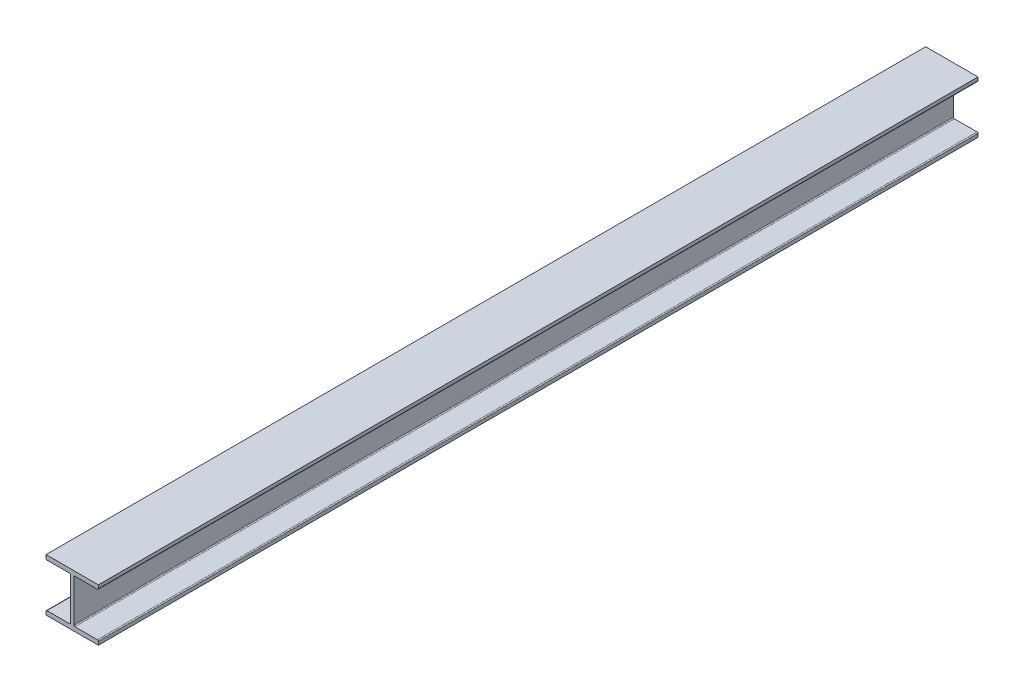
ISO-10303-21;
HEADER;
FILE_DESCRIPTION(('STEP AP214'),'2;1');
FILE_NAME('part.step','',(''),(''),'','','');
FILE_SCHEMA(('AUTOMOTIVE_DESIGN { 1 0 10303 214 1 1 1 1 }'));
ENDSEC;
DATA;
#1=APPLICATION_CONTEXT('core data for automotive mechanical design processes');
#2=APPLICATION_PROTOCOL_DEFINITION('international standard','automotive_design',2000,#1);
#3=PRODUCT_CONTEXT('',#1,'mechanical');
#4=PRODUCT('Part','Part','',(#3));
#5=PRODUCT_RELATED_PRODUCT_CATEGORY('part','',(#4));
#6=PRODUCT_DEFINITION_FORMATION('','',#4);
#7=PRODUCT_DEFINITION_CONTEXT('part definition',#1,'design');
#8=PRODUCT_DEFINITION('design','',#6,#7);
#9=PRODUCT_DEFINITION_SHAPE('','',#8);
#10=(LENGTH_UNIT() NAMED_UNIT(*) SI_UNIT(.MILLI.,.METRE.));
#11=(NAMED_UNIT(*) PLANE_ANGLE_UNIT() SI_UNIT($,.RADIAN.));
#12=(NAMED_UNIT(*) SI_UNIT($,.STERADIAN.) SOLID_ANGLE_UNIT());
#13=UNCERTAINTY_MEASURE_WITH_UNIT(LENGTH_MEASURE(1.E-05),#10,'distance_accuracy_value','');
#14=(GEOMETRIC_REPRESENTATION_CONTEXT(3) GLOBAL_UNCERTAINTY_ASSIGNED_CONTEXT((#13)) GLOBAL_UNIT_ASSIGNED_CONTEXT((#10,
#11,#12)) REPRESENTATION_CONTEXT('',''));
#15=CARTESIAN_POINT('',(0.,0.,0.));
#16=DIRECTION('',(0.,0.,1.));
#17=DIRECTION('',(1.,0.,0.));
#18=AXIS2_PLACEMENT_3D('',#15,#16,#17);
#19=CARTESIAN_POINT('',(0.,0.,2133.6));
#20=DIRECTION('',(0.,0.,-1.));
#21=DIRECTION('',(-1.,0.,0.));
#22=AXIS2_PLACEMENT_3D('',#19,#20,#21);
#23=PLANE('',#22);
#24=DIRECTION('',(0.,1.,0.));
#25=VECTOR('',#24,1.);
#26=CARTESIAN_POINT('',(63.5,-53.0352,2133.6));
#27=LINE('',#26,#25);
#28=CARTESIAN_POINT('',(63.5,-63.5,2133.6));
#29=VERTEX_POINT('',#28);
#30=CARTESIAN_POINT('',(63.5,-55.5752,2133.6));
#31=VERTEX_POINT('',#30);
#32=EDGE_CURVE('E202',#29,#31,#27,.T.);
#33=ORIENTED_EDGE('',*,*,#32,.T.);
#34=CARTESIAN_POINT('',(60.96,-55.5752,2133.6));
#35=DIRECTION('',(0.,0.,-1.));
#36=DIRECTION('',(-1.,0.,0.));
#37=AXIS2_PLACEMENT_3D('',#34,#35,#36);
#38=CIRCLE('',#37,2.54);
#39=CARTESIAN_POINT('',(60.96,-53.0352,2133.6));
#40=VERTEX_POINT('',#39);
#41=EDGE_CURVE('E244',#31,#40,#38,.F.);
#42=ORIENTED_EDGE('',*,*,#41,.T.);
#43=DIRECTION('',(-1.,0.,0.));
#44=VECTOR('',#43,1.);
#45=CARTESIAN_POINT('',(3.97510000000001,-53.0352,2133.6));
#46=LINE('',#45,#44);
#47=CARTESIAN_POINT('',(6.51510000000001,-53.0352,2133.6));
#48=VERTEX_POINT('',#47);
#49=EDGE_CURVE('E421',#40,#48,#46,.T.);
#50=ORIENTED_EDGE('',*,*,#49,.T.);
#51=CARTESIAN_POINT('',(6.51510000000001,-50.4952,2133.6));
#52=DIRECTION('',(0.,0.,-1.));
#53=DIRECTION('',(-1.,0.,0.));
#54=AXIS2_PLACEMENT_3D('',#51,#52,#53);
#55=CIRCLE('',#54,2.54);
#56=CARTESIAN_POINT('',(3.97510000000001,-50.4952,2133.6));
#57=VERTEX_POINT('',#56);
#58=EDGE_CURVE('E306',#48,#57,#55,.T.);
#59=ORIENTED_EDGE('',*,*,#58,.T.);
#60=DIRECTION('',(0.,1.,0.));
#61=VECTOR('',#60,1.);
#62=CARTESIAN_POINT('',(3.9751,33.9852,2133.6));
#63=LINE('',#62,#61);
#64=CARTESIAN_POINT('',(3.9751,50.4952,2133.6));
#65=VERTEX_POINT('',#64);
#66=EDGE_CURVE('E417',#57,#65,#63,.T.);
#67=ORIENTED_EDGE('',*,*,#66,.T.);
#68=CARTESIAN_POINT('',(6.5151,50.4952,2133.6));
#69=DIRECTION('',(0.,0.,-1.));
#70=DIRECTION('',(-1.,0.,0.));
#71=AXIS2_PLACEMENT_3D('',#68,#69,#70);
#72=CIRCLE('',#71,2.54);
#73=CARTESIAN_POINT('',(6.5151,53.0352,2133.6));
#74=VERTEX_POINT('',#73);
#75=EDGE_CURVE('E294',#65,#74,#72,.T.);
#76=ORIENTED_EDGE('',*,*,#75,.T.);
#77=DIRECTION('',(1.,0.,0.));
#78=VECTOR('',#77,1.);
#79=CARTESIAN_POINT('',(63.5,53.0352,2133.6));
#80=LINE('',#79,#78);
#81=CARTESIAN_POINT('',(60.96,53.0352,2133.6));
#82=VERTEX_POINT('',#81);
#83=EDGE_CURVE('E414',#74,#82,#80,.T.);
#84=ORIENTED_EDGE('',*,*,#83,.T.);
#85=CARTESIAN_POINT('',(60.96,55.5752,2133.6));
#86=DIRECTION('',(0.,0.,-1.));
#87=DIRECTION('',(-1.,0.,0.));
#88=AXIS2_PLACEMENT_3D('',#85,#86,#87);
#89=CIRCLE('',#88,2.54);
#90=CARTESIAN_POINT('',(63.5,55.5752,2133.6));
#91=VERTEX_POINT('',#90);
#92=EDGE_CURVE('E65',#82,#91,#89,.F.);
#93=ORIENTED_EDGE('',*,*,#92,.T.);
#94=DIRECTION('',(0.,1.,0.));
#95=VECTOR('',#94,1.);
#96=CARTESIAN_POINT('',(63.5,63.5,2133.6));
#97=LINE('',#96,#95);
#98=CARTESIAN_POINT('',(63.5,63.5,2133.6));
#99=VERTEX_POINT('',#98);
#100=EDGE_CURVE('E411',#91,#99,#97,.T.);
#101=ORIENTED_EDGE('',*,*,#100,.T.);
#102=DIRECTION('',(-1.,0.,0.));
#103=VECTOR('',#102,1.);
#104=CARTESIAN_POINT('',(-63.5,63.5,2133.6));
#105=LINE('',#104,#103);
#106=CARTESIAN_POINT('',(-63.5,63.5,2133.6));
#107=VERTEX_POINT('',#106);
#108=EDGE_CURVE('E388',#99,#107,#105,.T.);
#109=ORIENTED_EDGE('',*,*,#108,.T.);
#110=DIRECTION('',(0.,-1.,0.));
#111=VECTOR('',#110,1.);
#112=CARTESIAN_POINT('',(-63.5,63.5,2133.6));
#113=LINE('',#112,#111);
#114=CARTESIAN_POINT('',(-63.5,55.5752,2133.6));
#115=VERTEX_POINT('',#114);
#116=EDGE_CURVE('E401',#107,#115,#113,.T.);
#117=ORIENTED_EDGE('',*,*,#116,.T.);
#118=CARTESIAN_POINT('',(-60.96,55.5752,2133.6));
#119=DIRECTION('',(0.,0.,-1.));
#120=DIRECTION('',(-1.,0.,0.));
#121=AXIS2_PLACEMENT_3D('',#118,#119,#120);
#122=CIRCLE('',#121,2.54);
#123=CARTESIAN_POINT('',(-60.96,53.0352,2133.6));
#124=VERTEX_POINT('',#123);
#125=EDGE_CURVE('E239',#115,#124,#122,.F.);
#126=ORIENTED_EDGE('',*,*,#125,.T.);
#127=DIRECTION('',(1.,0.,0.));
#128=VECTOR('',#127,1.);
#129=CARTESIAN_POINT('',(-63.5,53.0352,2133.6));
#130=LINE('',#129,#128);
#131=CARTESIAN_POINT('',(-6.5151,53.0352,2133.6));
#132=VERTEX_POINT('',#131);
#133=EDGE_CURVE('E342',#124,#132,#130,.T.);
#134=ORIENTED_EDGE('',*,*,#133,.T.);
#135=CARTESIAN_POINT('',(-6.5151,50.4952,2133.6));
#136=DIRECTION('',(0.,0.,-1.));
#137=DIRECTION('',(-1.,0.,0.));
#138=AXIS2_PLACEMENT_3D('',#135,#136,#137);
#139=CIRCLE('',#138,2.54);
#140=CARTESIAN_POINT('',(-3.9751,50.4952,2133.6));
#141=VERTEX_POINT('',#140);
#142=EDGE_CURVE('E300',#132,#141,#139,.T.);
#143=ORIENTED_EDGE('',*,*,#142,.T.);
#144=DIRECTION('',(0.,-1.,0.));
#145=VECTOR('',#144,1.);
#146=CARTESIAN_POINT('',(-3.9751,33.9852,2133.6));
#147=LINE('',#146,#145);
#148=CARTESIAN_POINT('',(-3.97509999999998,-50.4952,2133.6));
#149=VERTEX_POINT('',#148);
#150=EDGE_CURVE('E331',#141,#149,#147,.T.);
#151=ORIENTED_EDGE('',*,*,#150,.T.);
#152=CARTESIAN_POINT('',(-6.51509999999998,-50.4952,2133.6));
#153=DIRECTION('',(0.,0.,-1.));
#154=DIRECTION('',(-1.,0.,0.));
#155=AXIS2_PLACEMENT_3D('',#152,#153,#154);
#156=CIRCLE('',#155,2.54);
#157=CARTESIAN_POINT('',(-6.51509999999998,-53.0352,2133.6));
#158=VERTEX_POINT('',#157);
#159=EDGE_CURVE('E11',#149,#158,#156,.T.);
#160=ORIENTED_EDGE('',*,*,#159,.T.);
#161=DIRECTION('',(-1.,0.,0.));
#162=VECTOR('',#161,1.);
#163=CARTESIAN_POINT('',(-3.97509999999998,-53.0352,2133.6));
#164=LINE('',#163,#162);
#165=CARTESIAN_POINT('',(-60.96,-53.0352,2133.6));
#166=VERTEX_POINT('',#165);
#167=EDGE_CURVE('E330',#158,#166,#164,.T.);
#168=ORIENTED_EDGE('',*,*,#167,.T.);
#169=CARTESIAN_POINT('',(-60.96,-55.5752,2133.6));
#170=DIRECTION('',(0.,0.,-1.));
#171=DIRECTION('',(-1.,0.,0.));
#172=AXIS2_PLACEMENT_3D('',#169,#170,#171);
#173=CIRCLE('',#172,2.54);
#174=CARTESIAN_POINT('',(-63.5,-55.5752,2133.6));
#175=VERTEX_POINT('',#174);
#176=EDGE_CURVE('E186',#166,#175,#173,.F.);
#177=ORIENTED_EDGE('',*,*,#176,.T.);
#178=DIRECTION('',(0.,-1.,0.));
#179=VECTOR('',#178,1.);
#180=CARTESIAN_POINT('',(-63.5,-53.0352,2133.6));
#181=LINE('',#180,#179);
#182=CARTESIAN_POINT('',(-63.5,-63.5,2133.6));
#183=VERTEX_POINT('',#182);
#184=EDGE_CURVE('E179',#175,#183,#181,.T.);
#185=ORIENTED_EDGE('',*,*,#184,.T.);
#186=DIRECTION('',(1.,0.,0.));
#187=VECTOR('',#186,1.);
#188=CARTESIAN_POINT('',(63.5,-63.5,2133.6));
#189=LINE('',#188,#187);
#190=EDGE_CURVE('E182',#183,#29,#189,.T.);
#191=ORIENTED_EDGE('',*,*,#190,.T.);
#192=EDGE_LOOP('',(#33,#42,#50,#59,#67,#76,#84,#93,#101,#109,#117,#126,#134,#143,#151,#160,#168,
#177,#185,#191));
#193=FACE_BOUND('',#192,.T.);
#194=ADVANCED_FACE('F41',(#193),#23,.F.);
#195=CARTESIAN_POINT('',(0.,0.,0.));
#196=DIRECTION('',(0.,0.,-1.));
#197=DIRECTION('',(-1.,0.,0.));
#198=AXIS2_PLACEMENT_3D('',#195,#196,#197);
#199=PLANE('',#198);
#200=DIRECTION('',(-1.,0.,0.));
#201=VECTOR('',#200,1.);
#202=CARTESIAN_POINT('',(3.97510000000001,-53.0352,0.));
#203=LINE('',#202,#201);
#204=CARTESIAN_POINT('',(60.96,-53.0352,0.));
#205=VERTEX_POINT('',#204);
#206=CARTESIAN_POINT('',(6.51510000000001,-53.0352,0.));
#207=VERTEX_POINT('',#206);
#208=EDGE_CURVE('E355',#205,#207,#203,.T.);
#209=ORIENTED_EDGE('',*,*,#208,.F.);
#210=CARTESIAN_POINT('',(60.96,-55.5752,0.));
#211=DIRECTION('',(0.,0.,-1.));
#212=DIRECTION('',(-1.,0.,0.));
#213=AXIS2_PLACEMENT_3D('',#210,#211,#212);
#214=CIRCLE('',#213,2.54);
#215=CARTESIAN_POINT('',(63.5,-55.5752,0.));
#216=VERTEX_POINT('',#215);
#217=EDGE_CURVE('E231',#205,#216,#214,.T.);
#218=ORIENTED_EDGE('',*,*,#217,.T.);
#219=DIRECTION('',(0.,1.,0.));
#220=VECTOR('',#219,1.);
#221=CARTESIAN_POINT('',(63.5,-53.0352,0.));
#222=LINE('',#221,#220);
#223=CARTESIAN_POINT('',(63.5,-63.5,0.));
#224=VERTEX_POINT('',#223);
#225=EDGE_CURVE('E351',#224,#216,#222,.T.);
#226=ORIENTED_EDGE('',*,*,#225,.F.);
#227=DIRECTION('',(1.,0.,0.));
#228=VECTOR('',#227,1.);
#229=CARTESIAN_POINT('',(63.5,-63.5,0.));
#230=LINE('',#229,#228);
#231=CARTESIAN_POINT('',(-63.5,-63.5,0.));
#232=VERTEX_POINT('',#231);
#233=EDGE_CURVE('E348',#232,#224,#230,.T.);
#234=ORIENTED_EDGE('',*,*,#233,.F.);
#235=DIRECTION('',(0.,-1.,0.));
#236=VECTOR('',#235,1.);
#237=CARTESIAN_POINT('',(-63.5,-53.0352,0.));
#238=LINE('',#237,#236);
#239=CARTESIAN_POINT('',(-63.5,-55.5752,0.));
#240=VERTEX_POINT('',#239);
#241=EDGE_CURVE('E206',#240,#232,#238,.T.);
#242=ORIENTED_EDGE('',*,*,#241,.F.);
#243=CARTESIAN_POINT('',(-60.96,-55.5752,0.));
#244=DIRECTION('',(0.,0.,-1.));
#245=DIRECTION('',(-1.,0.,0.));
#246=AXIS2_PLACEMENT_3D('',#243,#244,#245);
#247=CIRCLE('',#246,2.54);
#248=CARTESIAN_POINT('',(-60.96,-53.0352,0.));
#249=VERTEX_POINT('',#248);
#250=EDGE_CURVE('E228',#240,#249,#247,.T.);
#251=ORIENTED_EDGE('',*,*,#250,.T.);
#252=DIRECTION('',(-1.,0.,0.));
#253=VECTOR('',#252,1.);
#254=CARTESIAN_POINT('',(-3.97509999999998,-53.0352,0.));
#255=LINE('',#254,#253);
#256=CARTESIAN_POINT('',(-6.51509999999998,-53.0352,0.));
#257=VERTEX_POINT('',#256);
#258=EDGE_CURVE('E192',#257,#249,#255,.T.);
#259=ORIENTED_EDGE('',*,*,#258,.F.);
#260=CARTESIAN_POINT('',(-6.51509999999998,-50.4952,0.));
#261=DIRECTION('',(0.,0.,-1.));
#262=DIRECTION('',(-1.,0.,0.));
#263=AXIS2_PLACEMENT_3D('',#260,#261,#262);
#264=CIRCLE('',#263,2.54);
#265=CARTESIAN_POINT('',(-3.97509999999998,-50.4952,0.));
#266=VERTEX_POINT('',#265);
#267=EDGE_CURVE('E50',#257,#266,#264,.F.);
#268=ORIENTED_EDGE('',*,*,#267,.T.);
#269=DIRECTION('',(0.,-1.,0.));
#270=VECTOR('',#269,1.);
#271=CARTESIAN_POINT('',(-3.9751,33.9852,0.));
#272=LINE('',#271,#270);
#273=CARTESIAN_POINT('',(-3.9751,50.4952,0.));
#274=VERTEX_POINT('',#273);
#275=EDGE_CURVE('E315',#274,#266,#272,.T.);
#276=ORIENTED_EDGE('',*,*,#275,.F.);
#277=CARTESIAN_POINT('',(-6.5151,50.4952,0.));
#278=DIRECTION('',(0.,0.,-1.));
#279=DIRECTION('',(-1.,0.,0.));
#280=AXIS2_PLACEMENT_3D('',#277,#278,#279);
#281=CIRCLE('',#280,2.54);
#282=CARTESIAN_POINT('',(-6.5151,53.0352,0.));
#283=VERTEX_POINT('',#282);
#284=EDGE_CURVE('E297',#274,#283,#281,.F.);
#285=ORIENTED_EDGE('',*,*,#284,.T.);
#286=DIRECTION('',(1.,0.,0.));
#287=VECTOR('',#286,1.);
#288=CARTESIAN_POINT('',(-63.5,53.0352,0.));
#289=LINE('',#288,#287);
#290=CARTESIAN_POINT('',(-60.96,53.0352,0.));
#291=VERTEX_POINT('',#290);
#292=EDGE_CURVE('E326',#291,#283,#289,.T.);
#293=ORIENTED_EDGE('',*,*,#292,.F.);
#294=CARTESIAN_POINT('',(-60.96,55.5752,0.));
#295=DIRECTION('',(0.,0.,-1.));
#296=DIRECTION('',(-1.,0.,0.));
#297=AXIS2_PLACEMENT_3D('',#294,#295,#296);
#298=CIRCLE('',#297,2.54);
#299=CARTESIAN_POINT('',(-63.5,55.5752,0.));
#300=VERTEX_POINT('',#299);
#301=EDGE_CURVE('E225',#291,#300,#298,.T.);
#302=ORIENTED_EDGE('',*,*,#301,.T.);
#303=DIRECTION('',(0.,-1.,0.));
#304=VECTOR('',#303,1.);
#305=CARTESIAN_POINT('',(-63.5,63.5,0.));
#306=LINE('',#305,#304);
#307=CARTESIAN_POINT('',(-63.5,63.5,0.));
#308=VERTEX_POINT('',#307);
#309=EDGE_CURVE('E373',#308,#300,#306,.T.);
#310=ORIENTED_EDGE('',*,*,#309,.F.);
#311=DIRECTION('',(-1.,0.,0.));
#312=VECTOR('',#311,1.);
#313=CARTESIAN_POINT('',(-63.5,63.5,0.));
#314=LINE('',#313,#312);
#315=CARTESIAN_POINT('',(63.5,63.5,0.));
#316=VERTEX_POINT('',#315);
#317=EDGE_CURVE('E370',#316,#308,#314,.T.);
#318=ORIENTED_EDGE('',*,*,#317,.F.);
#319=DIRECTION('',(0.,1.,0.));
#320=VECTOR('',#319,1.);
#321=CARTESIAN_POINT('',(63.5,63.5,0.));
#322=LINE('',#321,#320);
#323=CARTESIAN_POINT('',(63.5,55.5752,0.));
#324=VERTEX_POINT('',#323);
#325=EDGE_CURVE('E367',#324,#316,#322,.T.);
#326=ORIENTED_EDGE('',*,*,#325,.F.);
#327=CARTESIAN_POINT('',(60.96,55.5752,0.));
#328=DIRECTION('',(0.,0.,-1.));
#329=DIRECTION('',(-1.,0.,0.));
#330=AXIS2_PLACEMENT_3D('',#327,#328,#329);
#331=CIRCLE('',#330,2.54);
#332=CARTESIAN_POINT('',(60.96,53.0352,0.));
#333=VERTEX_POINT('',#332);
#334=EDGE_CURVE('E222',#324,#333,#331,.T.);
#335=ORIENTED_EDGE('',*,*,#334,.T.);
#336=DIRECTION('',(1.,0.,0.));
#337=VECTOR('',#336,1.);
#338=CARTESIAN_POINT('',(63.5,53.0352,0.));
#339=LINE('',#338,#337);
#340=CARTESIAN_POINT('',(6.5151,53.0352,0.));
#341=VERTEX_POINT('',#340);
#342=EDGE_CURVE('E363',#341,#333,#339,.T.);
#343=ORIENTED_EDGE('',*,*,#342,.F.);
#344=CARTESIAN_POINT('',(6.5151,50.4952,0.));
#345=DIRECTION('',(0.,0.,-1.));
#346=DIRECTION('',(-1.,0.,0.));
#347=AXIS2_PLACEMENT_3D('',#344,#345,#346);
#348=CIRCLE('',#347,2.54);
#349=CARTESIAN_POINT('',(3.9751,50.4952,0.));
#350=VERTEX_POINT('',#349);
#351=EDGE_CURVE('E291',#341,#350,#348,.F.);
#352=ORIENTED_EDGE('',*,*,#351,.T.);
#353=DIRECTION('',(0.,1.,0.));
#354=VECTOR('',#353,1.);
#355=CARTESIAN_POINT('',(3.9751,33.9852,0.));
#356=LINE('',#355,#354);
#357=CARTESIAN_POINT('',(3.97510000000001,-50.4952,0.));
#358=VERTEX_POINT('',#357);
#359=EDGE_CURVE('E359',#358,#350,#356,.T.);
#360=ORIENTED_EDGE('',*,*,#359,.F.);
#361=CARTESIAN_POINT('',(6.51510000000001,-50.4952,0.));
#362=DIRECTION('',(0.,0.,-1.));
#363=DIRECTION('',(-1.,0.,0.));
#364=AXIS2_PLACEMENT_3D('',#361,#362,#363);
#365=CIRCLE('',#364,2.54);
#366=EDGE_CURVE('E303',#358,#207,#365,.F.);
#367=ORIENTED_EDGE('',*,*,#366,.T.);
#368=EDGE_LOOP('',(#209,#218,#226,#234,#242,#251,#259,#268,#276,#285,#293,#302,#310,#318,#326,
#335,#343,#352,#360,#367));
#369=FACE_BOUND('',#368,.T.);
#370=ADVANCED_FACE('F314',(#369),#199,.T.);
#371=CARTESIAN_POINT('',(-63.5,-53.0352,2133.6));
#372=DIRECTION('',(1.,0.,0.));
#373=DIRECTION('',(0.,0.,-1.));
#374=AXIS2_PLACEMENT_3D('',#371,#372,#373);
#375=PLANE('',#374);
#376=ORIENTED_EDGE('',*,*,#184,.F.);
#377=DIRECTION('',(0.,0.,-1.));
#378=VECTOR('',#377,1.);
#379=CARTESIAN_POINT('',(-63.5,-55.5752,2133.6));
#380=LINE('',#379,#378);
#381=EDGE_CURVE('E247',#175,#240,#380,.T.);
#382=ORIENTED_EDGE('',*,*,#381,.T.);
#383=ORIENTED_EDGE('',*,*,#241,.T.);
#384=DIRECTION('',(0.,0.,-1.));
#385=VECTOR('',#384,1.);
#386=CARTESIAN_POINT('',(-63.5,-63.5,2133.6));
#387=LINE('',#386,#385);
#388=EDGE_CURVE('E197',#183,#232,#387,.T.);
#389=ORIENTED_EDGE('',*,*,#388,.F.);
#390=EDGE_LOOP('',(#376,#382,#383,#389));
#391=FACE_BOUND('',#390,.T.);
#392=ADVANCED_FACE('F204',(#391),#375,.F.);
#393=CARTESIAN_POINT('',(63.5,-63.5,2133.6));
#394=DIRECTION('',(0.,1.,0.));
#395=DIRECTION('',(-1.,0.,0.));
#396=AXIS2_PLACEMENT_3D('',#393,#394,#395);
#397=PLANE('',#396);
#398=ORIENTED_EDGE('',*,*,#233,.T.);
#399=DIRECTION('',(0.,0.,-1.));
#400=VECTOR('',#399,1.);
#401=CARTESIAN_POINT('',(63.5,-63.5,2133.6));
#402=LINE('',#401,#400);
#403=EDGE_CURVE('E199',#29,#224,#402,.T.);
#404=ORIENTED_EDGE('',*,*,#403,.F.);
#405=ORIENTED_EDGE('',*,*,#190,.F.);
#406=ORIENTED_EDGE('',*,*,#388,.T.);
#407=EDGE_LOOP('',(#398,#404,#405,#406));
#408=FACE_BOUND('',#407,.T.);
#409=ADVANCED_FACE('F196',(#408),#397,.F.);
#410=CARTESIAN_POINT('',(63.5,-53.0352,2133.6));
#411=DIRECTION('',(-1.,0.,0.));
#412=DIRECTION('',(0.,0.,1.));
#413=AXIS2_PLACEMENT_3D('',#410,#411,#412);
#414=PLANE('',#413);
#415=ORIENTED_EDGE('',*,*,#225,.T.);
#416=DIRECTION('',(0.,0.,-1.));
#417=VECTOR('',#416,1.);
#418=CARTESIAN_POINT('',(63.5,-55.5752,2133.6));
#419=LINE('',#418,#417);
#420=EDGE_CURVE('E234',#216,#31,#419,.F.);
#421=ORIENTED_EDGE('',*,*,#420,.T.);
#422=ORIENTED_EDGE('',*,*,#32,.F.);
#423=ORIENTED_EDGE('',*,*,#403,.T.);
#424=EDGE_LOOP('',(#415,#421,#422,#423));
#425=FACE_BOUND('',#424,.T.);
#426=ADVANCED_FACE('F619',(#425),#414,.F.);
#427=CARTESIAN_POINT('',(3.97510000000001,-53.0352,2133.6));
#428=DIRECTION('',(0.,-1.,0.));
#429=DIRECTION('',(0.,0.,-1.));
#430=AXIS2_PLACEMENT_3D('',#427,#428,#429);
#431=PLANE('',#430);
#432=ORIENTED_EDGE('',*,*,#49,.F.);
#433=DIRECTION('',(0.,0.,-1.));
#434=VECTOR('',#433,1.);
#435=CARTESIAN_POINT('',(60.96,-53.0352,2133.6));
#436=LINE('',#435,#434);
#437=EDGE_CURVE('E213',#40,#205,#436,.T.);
#438=ORIENTED_EDGE('',*,*,#437,.T.);
#439=ORIENTED_EDGE('',*,*,#208,.T.);
#440=DIRECTION('',(0.,0.,-1.));
#441=VECTOR('',#440,1.);
#442=CARTESIAN_POINT('',(6.51510000000001,-53.0352,2133.6));
#443=LINE('',#442,#441);
#444=EDGE_CURVE('E209',#207,#48,#443,.F.);
#445=ORIENTED_EDGE('',*,*,#444,.T.);
#446=EDGE_LOOP('',(#432,#438,#439,#445));
#447=FACE_BOUND('',#446,.T.);
#448=ADVANCED_FACE('F434',(#447),#431,.F.);
#449=CARTESIAN_POINT('',(3.9751,33.9852,2133.6));
#450=DIRECTION('',(-1.,0.,0.));
#451=DIRECTION('',(0.,-1.,0.));
#452=AXIS2_PLACEMENT_3D('',#449,#450,#451);
#453=PLANE('',#452);
#454=ORIENTED_EDGE('',*,*,#359,.T.);
#455=DIRECTION('',(0.,0.,-1.));
#456=VECTOR('',#455,1.);
#457=CARTESIAN_POINT('',(3.9751,50.4952,2133.6));
#458=LINE('',#457,#456);
#459=EDGE_CURVE('E281',#350,#65,#458,.F.);
#460=ORIENTED_EDGE('',*,*,#459,.T.);
#461=ORIENTED_EDGE('',*,*,#66,.F.);
#462=DIRECTION('',(0.,0.,-1.));
#463=VECTOR('',#462,1.);
#464=CARTESIAN_POINT('',(3.97510000000001,-50.4952,0.));
#465=LINE('',#464,#463);
#466=EDGE_CURVE('E277',#57,#358,#465,.T.);
#467=ORIENTED_EDGE('',*,*,#466,.T.);
#468=EDGE_LOOP('',(#454,#460,#461,#467));
#469=FACE_BOUND('',#468,.T.);
#470=ADVANCED_FACE('F444',(#469),#453,.F.);
#471=CARTESIAN_POINT('',(63.5,53.0352,2133.6));
#472=DIRECTION('',(0.,1.,0.));
#473=DIRECTION('',(0.,0.,1.));
#474=AXIS2_PLACEMENT_3D('',#471,#472,#473);
#475=PLANE('',#474);
#476=ORIENTED_EDGE('',*,*,#342,.T.);
#477=DIRECTION('',(0.,0.,-1.));
#478=VECTOR('',#477,1.);
#479=CARTESIAN_POINT('',(60.96,53.0352,2133.6));
#480=LINE('',#479,#478);
#481=EDGE_CURVE('E274',#333,#82,#480,.F.);
#482=ORIENTED_EDGE('',*,*,#481,.T.);
#483=ORIENTED_EDGE('',*,*,#83,.F.);
#484=DIRECTION('',(0.,0.,-1.));
#485=VECTOR('',#484,1.);
#486=CARTESIAN_POINT('',(6.5151,53.0352,0.));
#487=LINE('',#486,#485);
#488=EDGE_CURVE('E270',#74,#341,#487,.T.);
#489=ORIENTED_EDGE('',*,*,#488,.T.);
#490=EDGE_LOOP('',(#476,#482,#483,#489));
#491=FACE_BOUND('',#490,.T.);
#492=ADVANCED_FACE('F453',(#491),#475,.F.);
#493=CARTESIAN_POINT('',(63.5,63.5,2133.6));
#494=DIRECTION('',(-1.,0.,0.));
#495=DIRECTION('',(0.,0.,1.));
#496=AXIS2_PLACEMENT_3D('',#493,#494,#495);
#497=PLANE('',#496);
#498=ORIENTED_EDGE('',*,*,#100,.F.);
#499=DIRECTION('',(0.,0.,-1.));
#500=VECTOR('',#499,1.);
#501=CARTESIAN_POINT('',(63.5,55.5752,2133.6));
#502=LINE('',#501,#500);
#503=EDGE_CURVE('E266',#91,#324,#502,.T.);
#504=ORIENTED_EDGE('',*,*,#503,.T.);
#505=ORIENTED_EDGE('',*,*,#325,.T.);
#506=DIRECTION('',(0.,0.,-1.));
#507=VECTOR('',#506,1.);
#508=CARTESIAN_POINT('',(63.5,63.5,2133.6));
#509=LINE('',#508,#507);
#510=EDGE_CURVE('E215',#99,#316,#509,.T.);
#511=ORIENTED_EDGE('',*,*,#510,.F.);
#512=EDGE_LOOP('',(#498,#504,#505,#511));
#513=FACE_BOUND('',#512,.T.);
#514=ADVANCED_FACE('F458',(#513),#497,.F.);
#515=CARTESIAN_POINT('',(-63.5,63.5,2133.6));
#516=DIRECTION('',(0.,-1.,0.));
#517=DIRECTION('',(1.,0.,0.));
#518=AXIS2_PLACEMENT_3D('',#515,#516,#517);
#519=PLANE('',#518);
#520=ORIENTED_EDGE('',*,*,#317,.T.);
#521=DIRECTION('',(0.,0.,-1.));
#522=VECTOR('',#521,1.);
#523=CARTESIAN_POINT('',(-63.5,63.5,2133.6));
#524=LINE('',#523,#522);
#525=EDGE_CURVE('E336',#107,#308,#524,.T.);
#526=ORIENTED_EDGE('',*,*,#525,.F.);
#527=ORIENTED_EDGE('',*,*,#108,.F.);
#528=ORIENTED_EDGE('',*,*,#510,.T.);
#529=EDGE_LOOP('',(#520,#526,#527,#528));
#530=FACE_BOUND('',#529,.T.);
#531=ADVANCED_FACE('F386',(#530),#519,.F.);
#532=CARTESIAN_POINT('',(-63.5,63.5,2133.6));
#533=DIRECTION('',(1.,0.,0.));
#534=DIRECTION('',(0.,0.,-1.));
#535=AXIS2_PLACEMENT_3D('',#532,#533,#534);
#536=PLANE('',#535);
#537=ORIENTED_EDGE('',*,*,#309,.T.);
#538=DIRECTION('',(0.,0.,-1.));
#539=VECTOR('',#538,1.);
#540=CARTESIAN_POINT('',(-63.5,55.5752,2133.6));
#541=LINE('',#540,#539);
#542=EDGE_CURVE('E57',#300,#115,#541,.F.);
#543=ORIENTED_EDGE('',*,*,#542,.T.);
#544=ORIENTED_EDGE('',*,*,#116,.F.);
#545=ORIENTED_EDGE('',*,*,#525,.T.);
#546=EDGE_LOOP('',(#537,#543,#544,#545));
#547=FACE_BOUND('',#546,.T.);
#548=ADVANCED_FACE('F393',(#547),#536,.F.);
#549=CARTESIAN_POINT('',(-63.5,53.0352,2133.6));
#550=DIRECTION('',(0.,1.,0.));
#551=DIRECTION('',(-1.,0.,0.));
#552=AXIS2_PLACEMENT_3D('',#549,#550,#551);
#553=PLANE('',#552);
#554=ORIENTED_EDGE('',*,*,#133,.F.);
#555=DIRECTION('',(0.,0.,-1.));
#556=VECTOR('',#555,1.);
#557=CARTESIAN_POINT('',(-60.96,53.0352,2133.6));
#558=LINE('',#557,#556);
#559=EDGE_CURVE('E260',#124,#291,#558,.T.);
#560=ORIENTED_EDGE('',*,*,#559,.T.);
#561=ORIENTED_EDGE('',*,*,#292,.T.);
#562=DIRECTION('',(0.,0.,-1.));
#563=VECTOR('',#562,1.);
#564=CARTESIAN_POINT('',(-6.5151,53.0352,2133.6));
#565=LINE('',#564,#563);
#566=EDGE_CURVE('E257',#283,#132,#565,.F.);
#567=ORIENTED_EDGE('',*,*,#566,.T.);
#568=EDGE_LOOP('',(#554,#560,#561,#567));
#569=FACE_BOUND('',#568,.T.);
#570=ADVANCED_FACE('F403',(#569),#553,.F.);
#571=CARTESIAN_POINT('',(-3.9751,33.9852,2133.6));
#572=DIRECTION('',(1.,0.,0.));
#573=DIRECTION('',(0.,1.,0.));
#574=AXIS2_PLACEMENT_3D('',#571,#572,#573);
#575=PLANE('',#574);
#576=ORIENTED_EDGE('',*,*,#150,.F.);
#577=DIRECTION('',(0.,0.,-1.));
#578=VECTOR('',#577,1.);
#579=CARTESIAN_POINT('',(-3.9751,50.4952,0.));
#580=LINE('',#579,#578);
#581=EDGE_CURVE('E287',#141,#274,#580,.T.);
#582=ORIENTED_EDGE('',*,*,#581,.T.);
#583=ORIENTED_EDGE('',*,*,#275,.T.);
#584=DIRECTION('',(0.,0.,-1.));
#585=VECTOR('',#584,1.);
#586=CARTESIAN_POINT('',(-3.97509999999998,-50.4952,2133.6));
#587=LINE('',#586,#585);
#588=EDGE_CURVE('E284',#266,#149,#587,.F.);
#589=ORIENTED_EDGE('',*,*,#588,.T.);
#590=EDGE_LOOP('',(#576,#582,#583,#589));
#591=FACE_BOUND('',#590,.T.);
#592=ADVANCED_FACE('F322',(#591),#575,.F.);
#593=CARTESIAN_POINT('',(-3.97509999999998,-53.0352,2133.6));
#594=DIRECTION('',(0.,-1.,0.));
#595=DIRECTION('',(1.,0.,0.));
#596=AXIS2_PLACEMENT_3D('',#593,#594,#595);
#597=PLANE('',#596);
#598=ORIENTED_EDGE('',*,*,#258,.T.);
#599=DIRECTION('',(0.,0.,-1.));
#600=VECTOR('',#599,1.);
#601=CARTESIAN_POINT('',(-60.96,-53.0352,2133.6));
#602=LINE('',#601,#600);
#603=EDGE_CURVE('E254',#249,#166,#602,.F.);
#604=ORIENTED_EDGE('',*,*,#603,.T.);
#605=ORIENTED_EDGE('',*,*,#167,.F.);
#606=DIRECTION('',(0.,0.,-1.));
#607=VECTOR('',#606,1.);
#608=CARTESIAN_POINT('',(-6.51509999999998,-53.0352,0.));
#609=LINE('',#608,#607);
#610=EDGE_CURVE('E250',#158,#257,#609,.T.);
#611=ORIENTED_EDGE('',*,*,#610,.T.);
#612=EDGE_LOOP('',(#598,#604,#605,#611));
#613=FACE_BOUND('',#612,.T.);
#614=ADVANCED_FACE('F333',(#613),#597,.F.);
#615=CARTESIAN_POINT('',(60.96,-55.5752,2133.6));
#616=DIRECTION('',(0.,0.,-1.));
#617=DIRECTION('',(-1.,0.,0.));
#618=AXIS2_PLACEMENT_3D('',#615,#616,#617);
#619=CYLINDRICAL_SURFACE('',#618,2.54);
#620=ORIENTED_EDGE('',*,*,#41,.F.);
#621=ORIENTED_EDGE('',*,*,#420,.F.);
#622=ORIENTED_EDGE('',*,*,#217,.F.);
#623=ORIENTED_EDGE('',*,*,#437,.F.);
#624=EDGE_LOOP('',(#620,#621,#622,#623));
#625=FACE_BOUND('',#624,.T.);
#626=ADVANCED_FACE('F432',(#625),#619,.T.);
#627=CARTESIAN_POINT('',(-60.96,-55.5752,2133.6));
#628=DIRECTION('',(0.,0.,-1.));
#629=DIRECTION('',(-1.,0.,0.));
#630=AXIS2_PLACEMENT_3D('',#627,#628,#629);
#631=CYLINDRICAL_SURFACE('',#630,2.54);
#632=ORIENTED_EDGE('',*,*,#176,.F.);
#633=ORIENTED_EDGE('',*,*,#603,.F.);
#634=ORIENTED_EDGE('',*,*,#250,.F.);
#635=ORIENTED_EDGE('',*,*,#381,.F.);
#636=EDGE_LOOP('',(#632,#633,#634,#635));
#637=FACE_BOUND('',#636,.T.);
#638=ADVANCED_FACE('F503',(#637),#631,.T.);
#639=CARTESIAN_POINT('',(-60.96,55.5752,2133.6));
#640=DIRECTION('',(0.,0.,-1.));
#641=DIRECTION('',(-1.,0.,0.));
#642=AXIS2_PLACEMENT_3D('',#639,#640,#641);
#643=CYLINDRICAL_SURFACE('',#642,2.54);
#644=ORIENTED_EDGE('',*,*,#125,.F.);
#645=ORIENTED_EDGE('',*,*,#542,.F.);
#646=ORIENTED_EDGE('',*,*,#301,.F.);
#647=ORIENTED_EDGE('',*,*,#559,.F.);
#648=EDGE_LOOP('',(#644,#645,#646,#647));
#649=FACE_BOUND('',#648,.T.);
#650=ADVANCED_FACE('F396',(#649),#643,.T.);
#651=CARTESIAN_POINT('',(60.96,55.5752,2133.6));
#652=DIRECTION('',(0.,0.,-1.));
#653=DIRECTION('',(-1.,0.,0.));
#654=AXIS2_PLACEMENT_3D('',#651,#652,#653);
#655=CYLINDRICAL_SURFACE('',#654,2.54);
#656=ORIENTED_EDGE('',*,*,#92,.F.);
#657=ORIENTED_EDGE('',*,*,#481,.F.);
#658=ORIENTED_EDGE('',*,*,#334,.F.);
#659=ORIENTED_EDGE('',*,*,#503,.F.);
#660=EDGE_LOOP('',(#656,#657,#658,#659));
#661=FACE_BOUND('',#660,.T.);
#662=ADVANCED_FACE('F457',(#661),#655,.T.);
#663=CARTESIAN_POINT('',(6.5151,50.4952,2133.6));
#664=DIRECTION('',(0.,0.,1.));
#665=DIRECTION('',(1.,0.,0.));
#666=AXIS2_PLACEMENT_3D('',#663,#664,#665);
#667=CYLINDRICAL_SURFACE('',#666,2.54);
#668=ORIENTED_EDGE('',*,*,#75,.F.);
#669=ORIENTED_EDGE('',*,*,#459,.F.);
#670=ORIENTED_EDGE('',*,*,#351,.F.);
#671=ORIENTED_EDGE('',*,*,#488,.F.);
#672=EDGE_LOOP('',(#668,#669,#670,#671));
#673=FACE_BOUND('',#672,.T.);
#674=ADVANCED_FACE('F450',(#673),#667,.F.);
#675=CARTESIAN_POINT('',(-6.5151,50.4952,2133.6));
#676=DIRECTION('',(0.,0.,1.));
#677=DIRECTION('',(1.,0.,0.));
#678=AXIS2_PLACEMENT_3D('',#675,#676,#677);
#679=CYLINDRICAL_SURFACE('',#678,2.54);
#680=ORIENTED_EDGE('',*,*,#142,.F.);
#681=ORIENTED_EDGE('',*,*,#566,.F.);
#682=ORIENTED_EDGE('',*,*,#284,.F.);
#683=ORIENTED_EDGE('',*,*,#581,.F.);
#684=EDGE_LOOP('',(#680,#681,#682,#683));
#685=FACE_BOUND('',#684,.T.);
#686=ADVANCED_FACE('F529',(#685),#679,.F.);
#687=CARTESIAN_POINT('',(6.51510000000001,-50.4952,2133.6));
#688=DIRECTION('',(0.,0.,1.));
#689=DIRECTION('',(1.,0.,0.));
#690=AXIS2_PLACEMENT_3D('',#687,#688,#689);
#691=CYLINDRICAL_SURFACE('',#690,2.54);
#692=ORIENTED_EDGE('',*,*,#58,.F.);
#693=ORIENTED_EDGE('',*,*,#444,.F.);
#694=ORIENTED_EDGE('',*,*,#366,.F.);
#695=ORIENTED_EDGE('',*,*,#466,.F.);
#696=EDGE_LOOP('',(#692,#693,#694,#695));
#697=FACE_BOUND('',#696,.T.);
#698=ADVANCED_FACE('F441',(#697),#691,.F.);
#699=CARTESIAN_POINT('',(-6.51509999999998,-50.4952,2133.6));
#700=DIRECTION('',(0.,0.,1.));
#701=DIRECTION('',(1.,0.,0.));
#702=AXIS2_PLACEMENT_3D('',#699,#700,#701);
#703=CYLINDRICAL_SURFACE('',#702,2.54);
#704=ORIENTED_EDGE('',*,*,#159,.F.);
#705=ORIENTED_EDGE('',*,*,#588,.F.);
#706=ORIENTED_EDGE('',*,*,#267,.F.);
#707=ORIENTED_EDGE('',*,*,#610,.F.);
#708=EDGE_LOOP('',(#704,#705,#706,#707));
#709=FACE_BOUND('',#708,.T.);
#710=ADVANCED_FACE('F43',(#709),#703,.F.);
#711=CLOSED_SHELL('',(#194,#370,#392,#409,#426,#448,#470,#492,#514,#531,#548,#570,#592,#614,
#626,#638,#650,#662,#674,#686,#698,#710));
#712=MANIFOLD_SOLID_BREP('B2',#711);
#713=ADVANCED_BREP_SHAPE_REPRESENTATION('',(#18,#712),#14);
#714=SHAPE_DEFINITION_REPRESENTATION(#9,#713);
ENDSEC;
END-ISO-10303-21;
